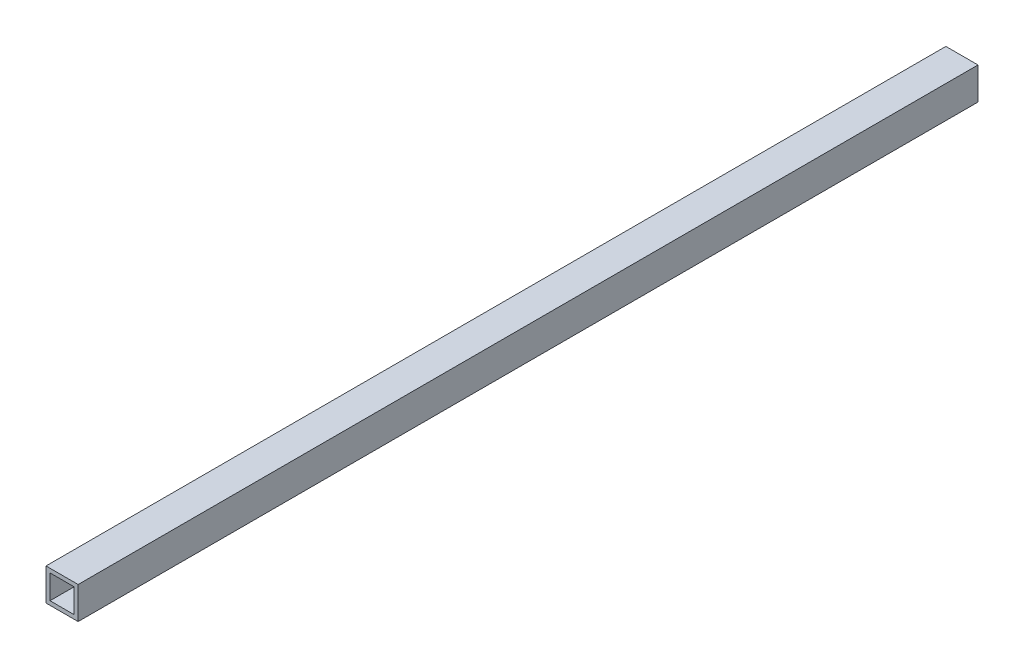
ISO-10303-21;
HEADER;
FILE_DESCRIPTION(('STEP AP214'),'2;1');
FILE_NAME('part.step','',(''),(''),'','','');
FILE_SCHEMA(('AUTOMOTIVE_DESIGN { 1 0 10303 214 1 1 1 1 }'));
ENDSEC;
DATA;
#1=APPLICATION_CONTEXT('core data for automotive mechanical design processes');
#2=APPLICATION_PROTOCOL_DEFINITION('international standard','automotive_design',2000,#1);
#3=PRODUCT_CONTEXT('',#1,'mechanical');
#4=PRODUCT('Part','Part','',(#3));
#5=PRODUCT_RELATED_PRODUCT_CATEGORY('part','',(#4));
#6=PRODUCT_DEFINITION_FORMATION('','',#4);
#7=PRODUCT_DEFINITION_CONTEXT('part definition',#1,'design');
#8=PRODUCT_DEFINITION('design','',#6,#7);
#9=PRODUCT_DEFINITION_SHAPE('','',#8);
#10=(LENGTH_UNIT() NAMED_UNIT(*) SI_UNIT(.MILLI.,.METRE.));
#11=(NAMED_UNIT(*) PLANE_ANGLE_UNIT() SI_UNIT($,.RADIAN.));
#12=(NAMED_UNIT(*) SI_UNIT($,.STERADIAN.) SOLID_ANGLE_UNIT());
#13=UNCERTAINTY_MEASURE_WITH_UNIT(LENGTH_MEASURE(1.E-05),#10,'distance_accuracy_value','');
#14=(GEOMETRIC_REPRESENTATION_CONTEXT(3) GLOBAL_UNCERTAINTY_ASSIGNED_CONTEXT((#13)) GLOBAL_UNIT_ASSIGNED_CONTEXT((#10,
#11,#12)) REPRESENTATION_CONTEXT('',''));
#15=CARTESIAN_POINT('',(0.,0.,0.));
#16=DIRECTION('',(0.,0.,1.));
#17=DIRECTION('',(1.,0.,0.));
#18=AXIS2_PLACEMENT_3D('',#15,#16,#17);
#19=CARTESIAN_POINT('',(0.,0.,711.2));
#20=DIRECTION('',(0.,0.,-1.));
#21=DIRECTION('',(-1.,0.,0.));
#22=AXIS2_PLACEMENT_3D('',#19,#20,#21);
#23=PLANE('',#22);
#24=DIRECTION('',(0.,-1.,0.));
#25=VECTOR('',#24,1.);
#26=CARTESIAN_POINT('',(0.,0.,711.2));
#27=LINE('',#26,#25);
#28=CARTESIAN_POINT('',(0.,25.4,711.2));
#29=VERTEX_POINT('',#28);
#30=CARTESIAN_POINT('',(0.,0.,711.2));
#31=VERTEX_POINT('',#30);
#32=EDGE_CURVE('E133',#29,#31,#27,.T.);
#33=ORIENTED_EDGE('',*,*,#32,.T.);
#34=DIRECTION('',(1.,0.,0.));
#35=VECTOR('',#34,1.);
#36=CARTESIAN_POINT('',(0.,0.,711.2));
#37=LINE('',#36,#35);
#38=CARTESIAN_POINT('',(25.4,0.,711.2));
#39=VERTEX_POINT('',#38);
#40=EDGE_CURVE('E136',#31,#39,#37,.T.);
#41=ORIENTED_EDGE('',*,*,#40,.T.);
#42=DIRECTION('',(0.,1.,0.));
#43=VECTOR('',#42,1.);
#44=CARTESIAN_POINT('',(25.4,0.,711.2));
#45=LINE('',#44,#43);
#46=CARTESIAN_POINT('',(25.4,25.4,711.2));
#47=VERTEX_POINT('',#46);
#48=EDGE_CURVE('E139',#39,#47,#45,.T.);
#49=ORIENTED_EDGE('',*,*,#48,.T.);
#50=DIRECTION('',(-1.,0.,0.));
#51=VECTOR('',#50,1.);
#52=CARTESIAN_POINT('',(0.,25.4,711.2));
#53=LINE('',#52,#51);
#54=EDGE_CURVE('E141',#47,#29,#53,.T.);
#55=ORIENTED_EDGE('',*,*,#54,.T.);
#56=EDGE_LOOP('',(#33,#41,#49,#55));
#57=FACE_BOUND('',#56,.T.);
#58=DIRECTION('',(0.,-1.,0.));
#59=VECTOR('',#58,1.);
#60=CARTESIAN_POINT('',(3.175,3.175,711.2));
#61=LINE('',#60,#59);
#62=CARTESIAN_POINT('',(3.175,22.225,711.2));
#63=VERTEX_POINT('',#62);
#64=CARTESIAN_POINT('',(3.175,3.175,711.2));
#65=VERTEX_POINT('',#64);
#66=EDGE_CURVE('E97',#63,#65,#61,.T.);
#67=ORIENTED_EDGE('',*,*,#66,.F.);
#68=DIRECTION('',(-1.,0.,0.));
#69=VECTOR('',#68,1.);
#70=CARTESIAN_POINT('',(3.175,22.225,711.2));
#71=LINE('',#70,#69);
#72=CARTESIAN_POINT('',(22.225,22.225,711.2));
#73=VERTEX_POINT('',#72);
#74=EDGE_CURVE('E119',#73,#63,#71,.T.);
#75=ORIENTED_EDGE('',*,*,#74,.F.);
#76=DIRECTION('',(0.,1.,0.));
#77=VECTOR('',#76,1.);
#78=CARTESIAN_POINT('',(22.225,3.175,711.2));
#79=LINE('',#78,#77);
#80=CARTESIAN_POINT('',(22.225,3.175,711.2));
#81=VERTEX_POINT('',#80);
#82=EDGE_CURVE('E117',#81,#73,#79,.T.);
#83=ORIENTED_EDGE('',*,*,#82,.F.);
#84=DIRECTION('',(1.,0.,0.));
#85=VECTOR('',#84,1.);
#86=CARTESIAN_POINT('',(3.175,3.175,711.2));
#87=LINE('',#86,#85);
#88=EDGE_CURVE('E105',#65,#81,#87,.T.);
#89=ORIENTED_EDGE('',*,*,#88,.F.);
#90=EDGE_LOOP('',(#67,#75,#83,#89));
#91=FACE_BOUND('',#90,.T.);
#92=ADVANCED_FACE('F32',(#57,#91),#23,.F.);
#93=CARTESIAN_POINT('',(0.,0.,0.));
#94=DIRECTION('',(0.,0.,-1.));
#95=DIRECTION('',(-1.,0.,0.));
#96=AXIS2_PLACEMENT_3D('',#93,#94,#95);
#97=PLANE('',#96);
#98=DIRECTION('',(0.,-1.,0.));
#99=VECTOR('',#98,1.);
#100=CARTESIAN_POINT('',(0.,0.,0.));
#101=LINE('',#100,#99);
#102=CARTESIAN_POINT('',(0.,25.4,0.));
#103=VERTEX_POINT('',#102);
#104=CARTESIAN_POINT('',(0.,0.,0.));
#105=VERTEX_POINT('',#104);
#106=EDGE_CURVE('E113',#103,#105,#101,.T.);
#107=ORIENTED_EDGE('',*,*,#106,.F.);
#108=DIRECTION('',(-1.,0.,0.));
#109=VECTOR('',#108,1.);
#110=CARTESIAN_POINT('',(0.,25.4,0.));
#111=LINE('',#110,#109);
#112=CARTESIAN_POINT('',(25.4,25.4,0.));
#113=VERTEX_POINT('',#112);
#114=EDGE_CURVE('E137',#113,#103,#111,.T.);
#115=ORIENTED_EDGE('',*,*,#114,.F.);
#116=DIRECTION('',(0.,1.,0.));
#117=VECTOR('',#116,1.);
#118=CARTESIAN_POINT('',(25.4,0.,0.));
#119=LINE('',#118,#117);
#120=CARTESIAN_POINT('',(25.4,0.,0.));
#121=VERTEX_POINT('',#120);
#122=EDGE_CURVE('E148',#121,#113,#119,.T.);
#123=ORIENTED_EDGE('',*,*,#122,.F.);
#124=DIRECTION('',(1.,0.,0.));
#125=VECTOR('',#124,1.);
#126=CARTESIAN_POINT('',(0.,0.,0.));
#127=LINE('',#126,#125);
#128=EDGE_CURVE('E146',#105,#121,#127,.T.);
#129=ORIENTED_EDGE('',*,*,#128,.F.);
#130=EDGE_LOOP('',(#107,#115,#123,#129));
#131=FACE_BOUND('',#130,.T.);
#132=DIRECTION('',(-1.,0.,0.));
#133=VECTOR('',#132,1.);
#134=CARTESIAN_POINT('',(3.175,22.225,0.));
#135=LINE('',#134,#133);
#136=CARTESIAN_POINT('',(22.225,22.225,0.));
#137=VERTEX_POINT('',#136);
#138=CARTESIAN_POINT('',(3.175,22.225,0.));
#139=VERTEX_POINT('',#138);
#140=EDGE_CURVE('E106',#137,#139,#135,.T.);
#141=ORIENTED_EDGE('',*,*,#140,.T.);
#142=DIRECTION('',(0.,-1.,0.));
#143=VECTOR('',#142,1.);
#144=CARTESIAN_POINT('',(3.175,3.175,0.));
#145=LINE('',#144,#143);
#146=CARTESIAN_POINT('',(3.175,3.175,0.));
#147=VERTEX_POINT('',#146);
#148=EDGE_CURVE('E55',#139,#147,#145,.T.);
#149=ORIENTED_EDGE('',*,*,#148,.T.);
#150=DIRECTION('',(1.,0.,0.));
#151=VECTOR('',#150,1.);
#152=CARTESIAN_POINT('',(3.175,3.175,0.));
#153=LINE('',#152,#151);
#154=CARTESIAN_POINT('',(22.225,3.175,0.));
#155=VERTEX_POINT('',#154);
#156=EDGE_CURVE('E112',#147,#155,#153,.T.);
#157=ORIENTED_EDGE('',*,*,#156,.T.);
#158=DIRECTION('',(0.,1.,0.));
#159=VECTOR('',#158,1.);
#160=CARTESIAN_POINT('',(22.225,3.175,0.));
#161=LINE('',#160,#159);
#162=EDGE_CURVE('E125',#155,#137,#161,.T.);
#163=ORIENTED_EDGE('',*,*,#162,.T.);
#164=EDGE_LOOP('',(#141,#149,#157,#163));
#165=FACE_BOUND('',#164,.T.);
#166=ADVANCED_FACE('F166',(#131,#165),#97,.T.);
#167=CARTESIAN_POINT('',(0.,0.,711.2));
#168=DIRECTION('',(1.,0.,0.));
#169=DIRECTION('',(0.,1.,0.));
#170=AXIS2_PLACEMENT_3D('',#167,#168,#169);
#171=PLANE('',#170);
#172=ORIENTED_EDGE('',*,*,#106,.T.);
#173=DIRECTION('',(0.,0.,-1.));
#174=VECTOR('',#173,1.);
#175=CARTESIAN_POINT('',(0.,0.,711.2));
#176=LINE('',#175,#174);
#177=EDGE_CURVE('E11',#31,#105,#176,.T.);
#178=ORIENTED_EDGE('',*,*,#177,.F.);
#179=ORIENTED_EDGE('',*,*,#32,.F.);
#180=DIRECTION('',(0.,0.,-1.));
#181=VECTOR('',#180,1.);
#182=CARTESIAN_POINT('',(0.,25.4,711.2));
#183=LINE('',#182,#181);
#184=EDGE_CURVE('E143',#29,#103,#183,.T.);
#185=ORIENTED_EDGE('',*,*,#184,.T.);
#186=EDGE_LOOP('',(#172,#178,#179,#185));
#187=FACE_BOUND('',#186,.T.);
#188=ADVANCED_FACE('F34',(#187),#171,.F.);
#189=CARTESIAN_POINT('',(0.,0.,711.2));
#190=DIRECTION('',(0.,1.,0.));
#191=DIRECTION('',(0.,0.,1.));
#192=AXIS2_PLACEMENT_3D('',#189,#190,#191);
#193=PLANE('',#192);
#194=ORIENTED_EDGE('',*,*,#128,.T.);
#195=DIRECTION('',(0.,0.,-1.));
#196=VECTOR('',#195,1.);
#197=CARTESIAN_POINT('',(25.4,0.,711.2));
#198=LINE('',#197,#196);
#199=EDGE_CURVE('E40',#39,#121,#198,.T.);
#200=ORIENTED_EDGE('',*,*,#199,.F.);
#201=ORIENTED_EDGE('',*,*,#40,.F.);
#202=ORIENTED_EDGE('',*,*,#177,.T.);
#203=EDGE_LOOP('',(#194,#200,#201,#202));
#204=FACE_BOUND('',#203,.T.);
#205=ADVANCED_FACE('F176',(#204),#193,.F.);
#206=CARTESIAN_POINT('',(25.4,0.,711.2));
#207=DIRECTION('',(-1.,0.,0.));
#208=DIRECTION('',(0.,-1.,0.));
#209=AXIS2_PLACEMENT_3D('',#206,#207,#208);
#210=PLANE('',#209);
#211=ORIENTED_EDGE('',*,*,#122,.T.);
#212=DIRECTION('',(0.,0.,-1.));
#213=VECTOR('',#212,1.);
#214=CARTESIAN_POINT('',(25.4,25.4,711.2));
#215=LINE('',#214,#213);
#216=EDGE_CURVE('E153',#47,#113,#215,.T.);
#217=ORIENTED_EDGE('',*,*,#216,.F.);
#218=ORIENTED_EDGE('',*,*,#48,.F.);
#219=ORIENTED_EDGE('',*,*,#199,.T.);
#220=EDGE_LOOP('',(#211,#217,#218,#219));
#221=FACE_BOUND('',#220,.T.);
#222=ADVANCED_FACE('F160',(#221),#210,.F.);
#223=CARTESIAN_POINT('',(0.,25.4,711.2));
#224=DIRECTION('',(0.,-1.,0.));
#225=DIRECTION('',(0.,0.,-1.));
#226=AXIS2_PLACEMENT_3D('',#223,#224,#225);
#227=PLANE('',#226);
#228=ORIENTED_EDGE('',*,*,#114,.T.);
#229=ORIENTED_EDGE('',*,*,#184,.F.);
#230=ORIENTED_EDGE('',*,*,#54,.F.);
#231=ORIENTED_EDGE('',*,*,#216,.T.);
#232=EDGE_LOOP('',(#228,#229,#230,#231));
#233=FACE_BOUND('',#232,.T.);
#234=ADVANCED_FACE('F170',(#233),#227,.F.);
#235=CARTESIAN_POINT('',(3.175,3.175,711.2));
#236=DIRECTION('',(1.,0.,0.));
#237=DIRECTION('',(0.,0.,-1.));
#238=AXIS2_PLACEMENT_3D('',#235,#236,#237);
#239=PLANE('',#238);
#240=ORIENTED_EDGE('',*,*,#148,.F.);
#241=DIRECTION('',(0.,0.,-1.));
#242=VECTOR('',#241,1.);
#243=CARTESIAN_POINT('',(3.175,22.225,711.2));
#244=LINE('',#243,#242);
#245=EDGE_CURVE('E101',#63,#139,#244,.T.);
#246=ORIENTED_EDGE('',*,*,#245,.F.);
#247=ORIENTED_EDGE('',*,*,#66,.T.);
#248=DIRECTION('',(0.,0.,-1.));
#249=VECTOR('',#248,1.);
#250=CARTESIAN_POINT('',(3.175,3.175,711.2));
#251=LINE('',#250,#249);
#252=EDGE_CURVE('E100',#65,#147,#251,.T.);
#253=ORIENTED_EDGE('',*,*,#252,.T.);
#254=EDGE_LOOP('',(#240,#246,#247,#253));
#255=FACE_BOUND('',#254,.T.);
#256=ADVANCED_FACE('F99',(#255),#239,.T.);
#257=CARTESIAN_POINT('',(3.175,3.175,711.2));
#258=DIRECTION('',(0.,1.,0.));
#259=DIRECTION('',(0.,0.,1.));
#260=AXIS2_PLACEMENT_3D('',#257,#258,#259);
#261=PLANE('',#260);
#262=ORIENTED_EDGE('',*,*,#156,.F.);
#263=ORIENTED_EDGE('',*,*,#252,.F.);
#264=ORIENTED_EDGE('',*,*,#88,.T.);
#265=DIRECTION('',(0.,0.,-1.));
#266=VECTOR('',#265,1.);
#267=CARTESIAN_POINT('',(22.225,3.175,711.2));
#268=LINE('',#267,#266);
#269=EDGE_CURVE('E114',#81,#155,#268,.T.);
#270=ORIENTED_EDGE('',*,*,#269,.T.);
#271=EDGE_LOOP('',(#262,#263,#264,#270));
#272=FACE_BOUND('',#271,.T.);
#273=ADVANCED_FACE('F109',(#272),#261,.T.);
#274=CARTESIAN_POINT('',(22.225,3.175,711.2));
#275=DIRECTION('',(-1.,0.,0.));
#276=DIRECTION('',(0.,0.,1.));
#277=AXIS2_PLACEMENT_3D('',#274,#275,#276);
#278=PLANE('',#277);
#279=ORIENTED_EDGE('',*,*,#162,.F.);
#280=ORIENTED_EDGE('',*,*,#269,.F.);
#281=ORIENTED_EDGE('',*,*,#82,.T.);
#282=DIRECTION('',(0.,0.,-1.));
#283=VECTOR('',#282,1.);
#284=CARTESIAN_POINT('',(22.225,22.225,711.2));
#285=LINE('',#284,#283);
#286=EDGE_CURVE('E47',#73,#137,#285,.T.);
#287=ORIENTED_EDGE('',*,*,#286,.T.);
#288=EDGE_LOOP('',(#279,#280,#281,#287));
#289=FACE_BOUND('',#288,.T.);
#290=ADVANCED_FACE('F199',(#289),#278,.T.);
#291=CARTESIAN_POINT('',(3.175,22.225,711.2));
#292=DIRECTION('',(0.,-1.,0.));
#293=DIRECTION('',(0.,0.,-1.));
#294=AXIS2_PLACEMENT_3D('',#291,#292,#293);
#295=PLANE('',#294);
#296=ORIENTED_EDGE('',*,*,#140,.F.);
#297=ORIENTED_EDGE('',*,*,#286,.F.);
#298=ORIENTED_EDGE('',*,*,#74,.T.);
#299=ORIENTED_EDGE('',*,*,#245,.T.);
#300=EDGE_LOOP('',(#296,#297,#298,#299));
#301=FACE_BOUND('',#300,.T.);
#302=ADVANCED_FACE('F203',(#301),#295,.T.);
#303=CLOSED_SHELL('',(#92,#166,#188,#205,#222,#234,#256,#273,#290,#302));
#304=MANIFOLD_SOLID_BREP('B2',#303);
#305=ADVANCED_BREP_SHAPE_REPRESENTATION('',(#18,#304),#14);
#306=SHAPE_DEFINITION_REPRESENTATION(#9,#305);
ENDSEC;
END-ISO-10303-21;
